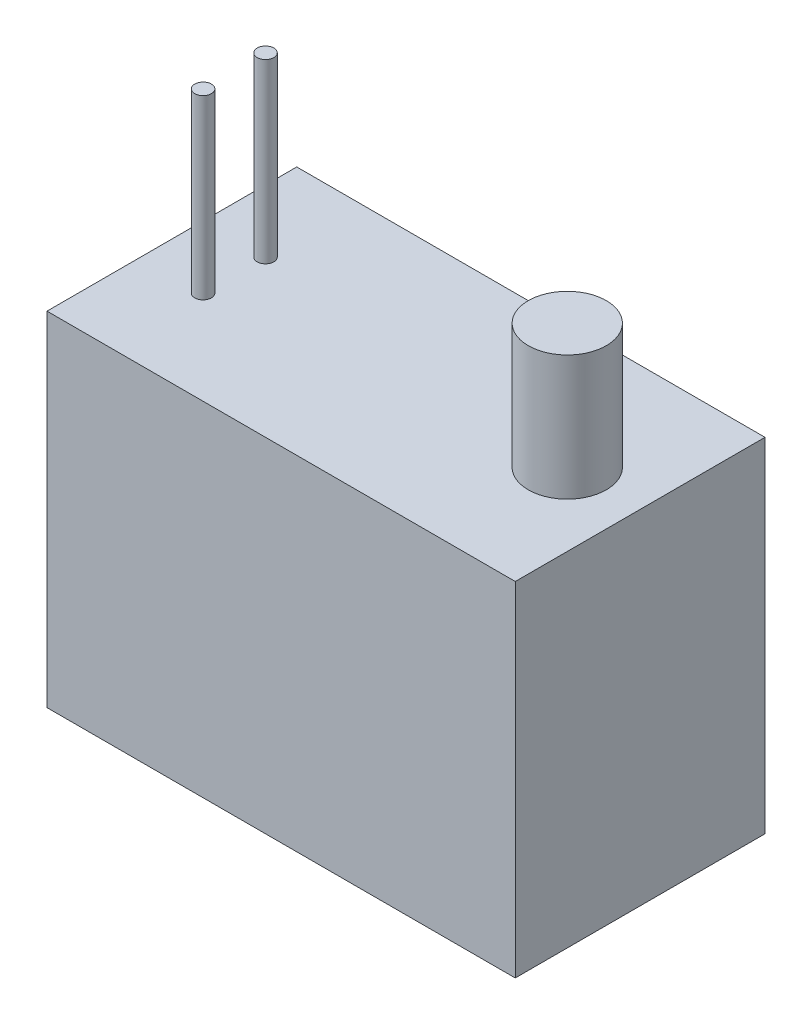
ISO-10303-21;
HEADER;
FILE_DESCRIPTION(('STEP AP214'),'2;1');
FILE_NAME('part.step','',(''),(''),'','','');
FILE_SCHEMA(('AUTOMOTIVE_DESIGN { 1 0 10303 214 1 1 1 1 }'));
ENDSEC;
DATA;
#1=APPLICATION_CONTEXT('core data for automotive mechanical design processes');
#2=APPLICATION_PROTOCOL_DEFINITION('international standard','automotive_design',2000,#1);
#3=PRODUCT_CONTEXT('',#1,'mechanical');
#4=PRODUCT('Part','Part','',(#3));
#5=PRODUCT_RELATED_PRODUCT_CATEGORY('part','',(#4));
#6=PRODUCT_DEFINITION_FORMATION('','',#4);
#7=PRODUCT_DEFINITION_CONTEXT('part definition',#1,'design');
#8=PRODUCT_DEFINITION('design','',#6,#7);
#9=PRODUCT_DEFINITION_SHAPE('','',#8);
#10=(LENGTH_UNIT() NAMED_UNIT(*) SI_UNIT(.MILLI.,.METRE.));
#11=(NAMED_UNIT(*) PLANE_ANGLE_UNIT() SI_UNIT($,.RADIAN.));
#12=(NAMED_UNIT(*) SI_UNIT($,.STERADIAN.) SOLID_ANGLE_UNIT());
#13=UNCERTAINTY_MEASURE_WITH_UNIT(LENGTH_MEASURE(1.E-05),#10,'distance_accuracy_value','');
#14=(GEOMETRIC_REPRESENTATION_CONTEXT(3) GLOBAL_UNCERTAINTY_ASSIGNED_CONTEXT((#13)) GLOBAL_UNIT_ASSIGNED_CONTEXT((#10,
#11,#12)) REPRESENTATION_CONTEXT('',''));
#15=CARTESIAN_POINT('',(0.,0.,0.));
#16=DIRECTION('',(0.,0.,1.));
#17=DIRECTION('',(1.,0.,0.));
#18=AXIS2_PLACEMENT_3D('',#15,#16,#17);
#19=CARTESIAN_POINT('',(6.,50.,-15.));
#20=DIRECTION('',(0.,-1.,0.));
#21=DIRECTION('',(0.,0.,-1.));
#22=AXIS2_PLACEMENT_3D('',#19,#20,#21);
#23=CYLINDRICAL_SURFACE('',#22,0.8);
#24=CARTESIAN_POINT('',(6.,50.,-15.));
#25=DIRECTION('',(0.,1.,0.));
#26=DIRECTION('',(0.,0.,1.));
#27=AXIS2_PLACEMENT_3D('',#24,#25,#26);
#28=CIRCLE('',#27,0.8);
#29=CARTESIAN_POINT('',(6.,50.,-14.2));
#30=VERTEX_POINT('',#29);
#31=EDGE_CURVE('E11',#30,#30,#28,.T.);
#32=ORIENTED_EDGE('',*,*,#31,.F.);
#33=EDGE_LOOP('',(#32));
#34=FACE_BOUND('',#33,.T.);
#35=CARTESIAN_POINT('',(6.,33.,-15.));
#36=DIRECTION('',(0.,1.,0.));
#37=DIRECTION('',(0.,0.,1.));
#38=AXIS2_PLACEMENT_3D('',#35,#36,#37);
#39=CIRCLE('',#38,0.8);
#40=CARTESIAN_POINT('',(6.,33.,-14.2));
#41=VERTEX_POINT('',#40);
#42=EDGE_CURVE('E60',#41,#41,#39,.T.);
#43=ORIENTED_EDGE('',*,*,#42,.T.);
#44=EDGE_LOOP('',(#43));
#45=FACE_BOUND('',#44,.T.);
#46=ADVANCED_FACE('F53',(#34,#45),#23,.T.);
#47=CARTESIAN_POINT('',(6.,50.,-15.));
#48=DIRECTION('',(0.,1.,0.));
#49=DIRECTION('',(0.,0.,1.));
#50=AXIS2_PLACEMENT_3D('',#47,#48,#49);
#51=PLANE('',#50);
#52=ORIENTED_EDGE('',*,*,#31,.T.);
#53=EDGE_LOOP('',(#52));
#54=FACE_BOUND('',#53,.T.);
#55=ADVANCED_FACE('F68',(#54),#51,.T.);
#56=CARTESIAN_POINT('',(6.,33.,-15.));
#57=DIRECTION('',(0.,1.,0.));
#58=DIRECTION('',(0.,0.,1.));
#59=AXIS2_PLACEMENT_3D('',#56,#57,#58);
#60=PLANE('',#59);
#61=ORIENTED_EDGE('',*,*,#42,.F.);
#62=EDGE_LOOP('',(#61));
#63=FACE_BOUND('',#62,.T.);
#64=ADVANCED_FACE('F70',(#63),#60,.F.);
#65=CLOSED_SHELL('',(#46,#55,#64));
#66=MANIFOLD_SOLID_BREP('B2',#65);
#67=CARTESIAN_POINT('',(6.,50.,-9.));
#68=DIRECTION('',(0.,-1.,0.));
#69=DIRECTION('',(0.,0.,-1.));
#70=AXIS2_PLACEMENT_3D('',#67,#68,#69);
#71=CYLINDRICAL_SURFACE('',#70,0.8);
#72=CARTESIAN_POINT('',(6.,50.,-9.));
#73=DIRECTION('',(0.,1.,0.));
#74=DIRECTION('',(0.,0.,1.));
#75=AXIS2_PLACEMENT_3D('',#72,#73,#74);
#76=CIRCLE('',#75,0.8);
#77=CARTESIAN_POINT('',(6.,50.,-8.2));
#78=VERTEX_POINT('',#77);
#79=EDGE_CURVE('E52',#78,#78,#76,.T.);
#80=ORIENTED_EDGE('',*,*,#79,.F.);
#81=EDGE_LOOP('',(#80));
#82=FACE_BOUND('',#81,.T.);
#83=CARTESIAN_POINT('',(6.,33.,-9.));
#84=DIRECTION('',(0.,1.,0.));
#85=DIRECTION('',(0.,0.,1.));
#86=AXIS2_PLACEMENT_3D('',#83,#84,#85);
#87=CIRCLE('',#86,0.8);
#88=CARTESIAN_POINT('',(6.,33.,-8.2));
#89=VERTEX_POINT('',#88);
#90=EDGE_CURVE('E120',#89,#89,#87,.T.);
#91=ORIENTED_EDGE('',*,*,#90,.T.);
#92=EDGE_LOOP('',(#91));
#93=FACE_BOUND('',#92,.T.);
#94=ADVANCED_FACE('F113',(#82,#93),#71,.T.);
#95=CARTESIAN_POINT('',(6.,50.,-9.));
#96=DIRECTION('',(0.,1.,0.));
#97=DIRECTION('',(0.,0.,1.));
#98=AXIS2_PLACEMENT_3D('',#95,#96,#97);
#99=PLANE('',#98);
#100=ORIENTED_EDGE('',*,*,#79,.T.);
#101=EDGE_LOOP('',(#100));
#102=FACE_BOUND('',#101,.T.);
#103=ADVANCED_FACE('F128',(#102),#99,.T.);
#104=CARTESIAN_POINT('',(6.,33.,-9.));
#105=DIRECTION('',(0.,1.,0.));
#106=DIRECTION('',(0.,0.,1.));
#107=AXIS2_PLACEMENT_3D('',#104,#105,#106);
#108=PLANE('',#107);
#109=ORIENTED_EDGE('',*,*,#90,.F.);
#110=EDGE_LOOP('',(#109));
#111=FACE_BOUND('',#110,.T.);
#112=ADVANCED_FACE('F126',(#111),#108,.F.);
#113=CLOSED_SHELL('',(#94,#103,#112));
#114=MANIFOLD_SOLID_BREP('B6',#113);
#115=CARTESIAN_POINT('',(0.,9.,-12.));
#116=DIRECTION('',(-1.,0.,0.));
#117=DIRECTION('',(0.,0.,1.));
#118=AXIS2_PLACEMENT_3D('',#115,#116,#117);
#119=CYLINDRICAL_SURFACE('',#118,4.);
#120=CARTESIAN_POINT('',(0.,9.,-12.));
#121=DIRECTION('',(1.,0.,0.));
#122=DIRECTION('',(0.,0.,-1.));
#123=AXIS2_PLACEMENT_3D('',#120,#121,#122);
#124=CIRCLE('',#123,4.);
#125=CARTESIAN_POINT('',(0.,9.,-16.));
#126=VERTEX_POINT('',#125);
#127=EDGE_CURVE('E111',#126,#126,#124,.T.);
#128=ORIENTED_EDGE('',*,*,#127,.F.);
#129=EDGE_LOOP('',(#128));
#130=FACE_BOUND('',#129,.T.);
#131=CARTESIAN_POINT('',(-2.,9.,-12.));
#132=DIRECTION('',(1.,0.,0.));
#133=DIRECTION('',(0.,0.,-1.));
#134=AXIS2_PLACEMENT_3D('',#131,#132,#133);
#135=CIRCLE('',#134,4.);
#136=CARTESIAN_POINT('',(-2.,9.,-16.));
#137=VERTEX_POINT('',#136);
#138=EDGE_CURVE('E178',#137,#137,#135,.T.);
#139=ORIENTED_EDGE('',*,*,#138,.T.);
#140=EDGE_LOOP('',(#139));
#141=FACE_BOUND('',#140,.T.);
#142=ADVANCED_FACE('F176',(#130,#141),#119,.T.);
#143=CARTESIAN_POINT('',(0.,9.,-12.));
#144=DIRECTION('',(1.,0.,0.));
#145=DIRECTION('',(0.,0.,-1.));
#146=AXIS2_PLACEMENT_3D('',#143,#144,#145);
#147=PLANE('',#146);
#148=ORIENTED_EDGE('',*,*,#127,.T.);
#149=EDGE_LOOP('',(#148));
#150=FACE_BOUND('',#149,.T.);
#151=ADVANCED_FACE('F191',(#150),#147,.T.);
#152=CARTESIAN_POINT('',(-2.,9.,-12.));
#153=DIRECTION('',(1.,0.,0.));
#154=DIRECTION('',(0.,0.,-1.));
#155=AXIS2_PLACEMENT_3D('',#152,#153,#154);
#156=PLANE('',#155);
#157=ORIENTED_EDGE('',*,*,#138,.F.);
#158=EDGE_LOOP('',(#157));
#159=FACE_BOUND('',#158,.T.);
#160=ADVANCED_FACE('F188',(#159),#156,.F.);
#161=CLOSED_SHELL('',(#142,#151,#160));
#162=MANIFOLD_SOLID_BREP('B48',#161);
#163=CARTESIAN_POINT('',(38.,45.,-12.));
#164=DIRECTION('',(0.,-1.,0.));
#165=DIRECTION('',(0.,0.,-1.));
#166=AXIS2_PLACEMENT_3D('',#163,#164,#165);
#167=CYLINDRICAL_SURFACE('',#166,3.75);
#168=CARTESIAN_POINT('',(38.,45.,-12.));
#169=DIRECTION('',(0.,1.,0.));
#170=DIRECTION('',(0.,0.,1.));
#171=AXIS2_PLACEMENT_3D('',#168,#169,#170);
#172=CIRCLE('',#171,3.75);
#173=CARTESIAN_POINT('',(38.,45.,-8.25));
#174=VERTEX_POINT('',#173);
#175=EDGE_CURVE('E172',#174,#174,#172,.T.);
#176=ORIENTED_EDGE('',*,*,#175,.F.);
#177=EDGE_LOOP('',(#176));
#178=FACE_BOUND('',#177,.T.);
#179=CARTESIAN_POINT('',(38.,33.,-12.));
#180=DIRECTION('',(0.,1.,0.));
#181=DIRECTION('',(0.,0.,1.));
#182=AXIS2_PLACEMENT_3D('',#179,#180,#181);
#183=CIRCLE('',#182,3.75);
#184=CARTESIAN_POINT('',(38.,33.,-8.25));
#185=VERTEX_POINT('',#184);
#186=EDGE_CURVE('E244',#185,#185,#183,.T.);
#187=ORIENTED_EDGE('',*,*,#186,.T.);
#188=EDGE_LOOP('',(#187));
#189=FACE_BOUND('',#188,.T.);
#190=ADVANCED_FACE('F236',(#178,#189),#167,.T.);
#191=CARTESIAN_POINT('',(38.,45.,-12.));
#192=DIRECTION('',(0.,1.,0.));
#193=DIRECTION('',(0.,0.,1.));
#194=AXIS2_PLACEMENT_3D('',#191,#192,#193);
#195=PLANE('',#194);
#196=ORIENTED_EDGE('',*,*,#175,.T.);
#197=EDGE_LOOP('',(#196));
#198=FACE_BOUND('',#197,.T.);
#199=ADVANCED_FACE('F251',(#198),#195,.T.);
#200=CARTESIAN_POINT('',(38.,33.,-12.));
#201=DIRECTION('',(0.,1.,0.));
#202=DIRECTION('',(0.,0.,1.));
#203=AXIS2_PLACEMENT_3D('',#200,#201,#202);
#204=PLANE('',#203);
#205=ORIENTED_EDGE('',*,*,#186,.F.);
#206=EDGE_LOOP('',(#205));
#207=FACE_BOUND('',#206,.T.);
#208=ADVANCED_FACE('F253',(#207),#204,.F.);
#209=CLOSED_SHELL('',(#190,#199,#208));
#210=MANIFOLD_SOLID_BREP('B108',#209);
#211=CARTESIAN_POINT('',(0.,33.,-24.));
#212=DIRECTION('',(1.,0.,0.));
#213=DIRECTION('',(0.,0.,-1.));
#214=AXIS2_PLACEMENT_3D('',#211,#212,#213);
#215=PLANE('',#214);
#216=DIRECTION('',(0.,0.,1.));
#217=VECTOR('',#216,1.);
#218=CARTESIAN_POINT('',(0.,0.,-24.));
#219=LINE('',#218,#217);
#220=CARTESIAN_POINT('',(0.,0.,-24.));
#221=VERTEX_POINT('',#220);
#222=CARTESIAN_POINT('',(0.,0.,0.));
#223=VERTEX_POINT('',#222);
#224=EDGE_CURVE('E353',#221,#223,#219,.T.);
#225=ORIENTED_EDGE('',*,*,#224,.T.);
#226=DIRECTION('',(0.,-1.,0.));
#227=VECTOR('',#226,1.);
#228=CARTESIAN_POINT('',(0.,33.,0.));
#229=LINE('',#228,#227);
#230=CARTESIAN_POINT('',(0.,33.,0.));
#231=VERTEX_POINT('',#230);
#232=EDGE_CURVE('E237',#231,#223,#229,.T.);
#233=ORIENTED_EDGE('',*,*,#232,.F.);
#234=DIRECTION('',(0.,0.,1.));
#235=VECTOR('',#234,1.);
#236=CARTESIAN_POINT('',(0.,33.,-24.));
#237=LINE('',#236,#235);
#238=CARTESIAN_POINT('',(0.,33.,-24.));
#239=VERTEX_POINT('',#238);
#240=EDGE_CURVE('E345',#239,#231,#237,.T.);
#241=ORIENTED_EDGE('',*,*,#240,.F.);
#242=DIRECTION('',(0.,-1.,0.));
#243=VECTOR('',#242,1.);
#244=CARTESIAN_POINT('',(0.,33.,-24.));
#245=LINE('',#244,#243);
#246=EDGE_CURVE('E348',#239,#221,#245,.T.);
#247=ORIENTED_EDGE('',*,*,#246,.T.);
#248=EDGE_LOOP('',(#225,#233,#241,#247));
#249=FACE_BOUND('',#248,.T.);
#250=ADVANCED_FACE('F292',(#249),#215,.F.);
#251=CARTESIAN_POINT('',(0.,33.,0.));
#252=DIRECTION('',(0.,0.,-1.));
#253=DIRECTION('',(-1.,0.,0.));
#254=AXIS2_PLACEMENT_3D('',#251,#252,#253);
#255=PLANE('',#254);
#256=DIRECTION('',(1.,0.,0.));
#257=VECTOR('',#256,1.);
#258=CARTESIAN_POINT('',(0.,0.,0.));
#259=LINE('',#258,#257);
#260=CARTESIAN_POINT('',(45.,0.,0.));
#261=VERTEX_POINT('',#260);
#262=EDGE_CURVE('E347',#223,#261,#259,.T.);
#263=ORIENTED_EDGE('',*,*,#262,.T.);
#264=DIRECTION('',(0.,-1.,0.));
#265=VECTOR('',#264,1.);
#266=CARTESIAN_POINT('',(45.,33.,0.));
#267=LINE('',#266,#265);
#268=CARTESIAN_POINT('',(45.,33.,0.));
#269=VERTEX_POINT('',#268);
#270=EDGE_CURVE('E298',#269,#261,#267,.T.);
#271=ORIENTED_EDGE('',*,*,#270,.F.);
#272=DIRECTION('',(1.,0.,0.));
#273=VECTOR('',#272,1.);
#274=CARTESIAN_POINT('',(0.,33.,0.));
#275=LINE('',#274,#273);
#276=EDGE_CURVE('E336',#231,#269,#275,.T.);
#277=ORIENTED_EDGE('',*,*,#276,.F.);
#278=ORIENTED_EDGE('',*,*,#232,.T.);
#279=EDGE_LOOP('',(#263,#271,#277,#278));
#280=FACE_BOUND('',#279,.T.);
#281=ADVANCED_FACE('F344',(#280),#255,.F.);
#282=CARTESIAN_POINT('',(45.,33.,-24.));
#283=DIRECTION('',(-1.,0.,0.));
#284=DIRECTION('',(0.,0.,1.));
#285=AXIS2_PLACEMENT_3D('',#282,#283,#284);
#286=PLANE('',#285);
#287=DIRECTION('',(0.,0.,-1.));
#288=VECTOR('',#287,1.);
#289=CARTESIAN_POINT('',(45.,0.,-24.));
#290=LINE('',#289,#288);
#291=CARTESIAN_POINT('',(45.,0.,-24.));
#292=VERTEX_POINT('',#291);
#293=EDGE_CURVE('E322',#261,#292,#290,.T.);
#294=ORIENTED_EDGE('',*,*,#293,.T.);
#295=DIRECTION('',(0.,-1.,0.));
#296=VECTOR('',#295,1.);
#297=CARTESIAN_POINT('',(45.,33.,-24.));
#298=LINE('',#297,#296);
#299=CARTESIAN_POINT('',(45.,33.,-24.));
#300=VERTEX_POINT('',#299);
#301=EDGE_CURVE('E350',#300,#292,#298,.T.);
#302=ORIENTED_EDGE('',*,*,#301,.F.);
#303=DIRECTION('',(0.,0.,-1.));
#304=VECTOR('',#303,1.);
#305=CARTESIAN_POINT('',(45.,33.,-24.));
#306=LINE('',#305,#304);
#307=EDGE_CURVE('E337',#269,#300,#306,.T.);
#308=ORIENTED_EDGE('',*,*,#307,.F.);
#309=ORIENTED_EDGE('',*,*,#270,.T.);
#310=EDGE_LOOP('',(#294,#302,#308,#309));
#311=FACE_BOUND('',#310,.T.);
#312=ADVANCED_FACE('F346',(#311),#286,.F.);
#313=CARTESIAN_POINT('',(0.,33.,-24.));
#314=DIRECTION('',(0.,0.,1.));
#315=DIRECTION('',(1.,0.,0.));
#316=AXIS2_PLACEMENT_3D('',#313,#314,#315);
#317=PLANE('',#316);
#318=DIRECTION('',(-1.,0.,0.));
#319=VECTOR('',#318,1.);
#320=CARTESIAN_POINT('',(0.,0.,-24.));
#321=LINE('',#320,#319);
#322=EDGE_CURVE('E329',#292,#221,#321,.T.);
#323=ORIENTED_EDGE('',*,*,#322,.T.);
#324=ORIENTED_EDGE('',*,*,#246,.F.);
#325=DIRECTION('',(-1.,0.,0.));
#326=VECTOR('',#325,1.);
#327=CARTESIAN_POINT('',(0.,33.,-24.));
#328=LINE('',#327,#326);
#329=EDGE_CURVE('E307',#300,#239,#328,.T.);
#330=ORIENTED_EDGE('',*,*,#329,.F.);
#331=ORIENTED_EDGE('',*,*,#301,.T.);
#332=EDGE_LOOP('',(#323,#324,#330,#331));
#333=FACE_BOUND('',#332,.T.);
#334=ADVANCED_FACE('F363',(#333),#317,.F.);
#335=CARTESIAN_POINT('',(0.,33.,0.));
#336=DIRECTION('',(0.,1.,0.));
#337=DIRECTION('',(0.,0.,1.));
#338=AXIS2_PLACEMENT_3D('',#335,#336,#337);
#339=PLANE('',#338);
#340=ORIENTED_EDGE('',*,*,#240,.T.);
#341=ORIENTED_EDGE('',*,*,#276,.T.);
#342=ORIENTED_EDGE('',*,*,#307,.T.);
#343=ORIENTED_EDGE('',*,*,#329,.T.);
#344=EDGE_LOOP('',(#340,#341,#342,#343));
#345=FACE_BOUND('',#344,.T.);
#346=ADVANCED_FACE('F340',(#345),#339,.T.);
#347=CARTESIAN_POINT('',(0.,0.,0.));
#348=DIRECTION('',(0.,1.,0.));
#349=DIRECTION('',(0.,0.,1.));
#350=AXIS2_PLACEMENT_3D('',#347,#348,#349);
#351=PLANE('',#350);
#352=ORIENTED_EDGE('',*,*,#224,.F.);
#353=ORIENTED_EDGE('',*,*,#322,.F.);
#354=ORIENTED_EDGE('',*,*,#293,.F.);
#355=ORIENTED_EDGE('',*,*,#262,.F.);
#356=EDGE_LOOP('',(#352,#353,#354,#355));
#357=FACE_BOUND('',#356,.T.);
#358=ADVANCED_FACE('F365',(#357),#351,.F.);
#359=CLOSED_SHELL('',(#250,#281,#312,#334,#346,#358));
#360=MANIFOLD_SOLID_BREP('B168',#359);
#361=ADVANCED_BREP_SHAPE_REPRESENTATION('',(#18,#66,#114,#162,#210,#360),#14);
#362=SHAPE_DEFINITION_REPRESENTATION(#9,#361);
ENDSEC;
END-ISO-10303-21;
